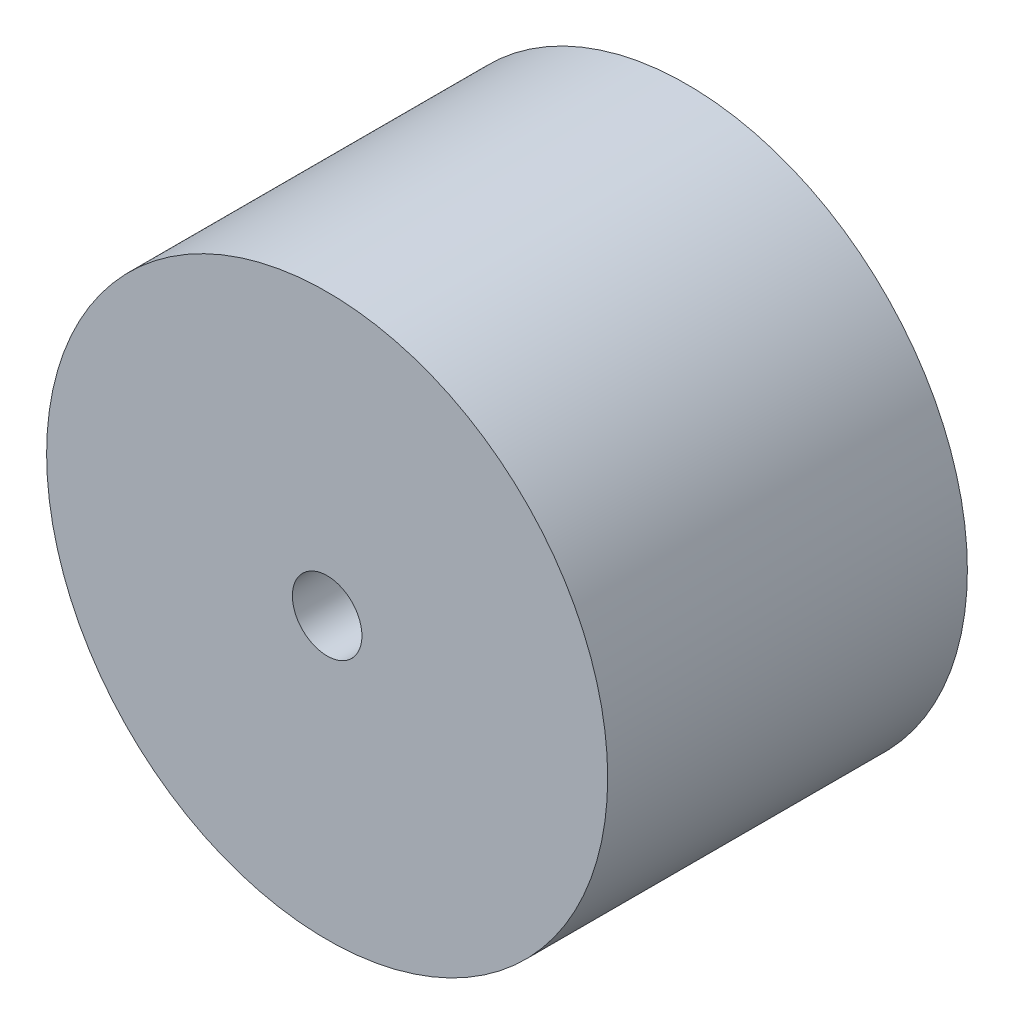
ISO-10303-21;
HEADER;
FILE_DESCRIPTION(('STEP AP214'),'2;1');
FILE_NAME('part.step','',(''),(''),'','','');
FILE_SCHEMA(('AUTOMOTIVE_DESIGN { 1 0 10303 214 1 1 1 1 }'));
ENDSEC;
DATA;
#1=APPLICATION_CONTEXT('core data for automotive mechanical design processes');
#2=APPLICATION_PROTOCOL_DEFINITION('international standard','automotive_design',2000,#1);
#3=PRODUCT_CONTEXT('',#1,'mechanical');
#4=PRODUCT('Part','Part','',(#3));
#5=PRODUCT_RELATED_PRODUCT_CATEGORY('part','',(#4));
#6=PRODUCT_DEFINITION_FORMATION('','',#4);
#7=PRODUCT_DEFINITION_CONTEXT('part definition',#1,'design');
#8=PRODUCT_DEFINITION('design','',#6,#7);
#9=PRODUCT_DEFINITION_SHAPE('','',#8);
#10=(LENGTH_UNIT() NAMED_UNIT(*) SI_UNIT(.MILLI.,.METRE.));
#11=(NAMED_UNIT(*) PLANE_ANGLE_UNIT() SI_UNIT($,.RADIAN.));
#12=(NAMED_UNIT(*) SI_UNIT($,.STERADIAN.) SOLID_ANGLE_UNIT());
#13=UNCERTAINTY_MEASURE_WITH_UNIT(LENGTH_MEASURE(1.E-05),#10,'distance_accuracy_value','');
#14=(GEOMETRIC_REPRESENTATION_CONTEXT(3) GLOBAL_UNCERTAINTY_ASSIGNED_CONTEXT((#13)) GLOBAL_UNIT_ASSIGNED_CONTEXT((#10,
#11,#12)) REPRESENTATION_CONTEXT('',''));
#15=CARTESIAN_POINT('',(0.,0.,0.));
#16=DIRECTION('',(0.,0.,1.));
#17=DIRECTION('',(1.,0.,0.));
#18=AXIS2_PLACEMENT_3D('',#15,#16,#17);
#19=CARTESIAN_POINT('',(0.,0.,525.272));
#20=DIRECTION('',(0.,0.,1.));
#21=DIRECTION('',(1.,0.,0.));
#22=AXIS2_PLACEMENT_3D('',#19,#20,#21);
#23=PLANE('',#22);
#24=CARTESIAN_POINT('',(0.,0.,525.272));
#25=DIRECTION('',(0.,0.,1.));
#26=DIRECTION('',(1.,0.,0.));
#27=AXIS2_PLACEMENT_3D('',#24,#25,#26);
#28=CIRCLE('',#27,409.702);
#29=CARTESIAN_POINT('',(409.702,0.,525.272));
#30=VERTEX_POINT('',#29);
#31=EDGE_CURVE('E10',#30,#30,#28,.T.);
#32=ORIENTED_EDGE('',*,*,#31,.T.);
#33=EDGE_LOOP('',(#32));
#34=FACE_BOUND('',#33,.T.);
#35=CARTESIAN_POINT('',(0.,0.,525.272));
#36=DIRECTION('',(0.,0.,1.));
#37=DIRECTION('',(1.,0.,0.));
#38=AXIS2_PLACEMENT_3D('',#35,#36,#37);
#39=CIRCLE('',#38,50.8);
#40=CARTESIAN_POINT('',(50.8,0.,525.272));
#41=VERTEX_POINT('',#40);
#42=EDGE_CURVE('E42',#41,#41,#39,.T.);
#43=ORIENTED_EDGE('',*,*,#42,.F.);
#44=EDGE_LOOP('',(#43));
#45=FACE_BOUND('',#44,.T.);
#46=ADVANCED_FACE('F31',(#34,#45),#23,.T.);
#47=CARTESIAN_POINT('',(0.,0.,0.));
#48=DIRECTION('',(0.,0.,1.));
#49=DIRECTION('',(1.,0.,0.));
#50=AXIS2_PLACEMENT_3D('',#47,#48,#49);
#51=PLANE('',#50);
#52=CARTESIAN_POINT('',(0.,0.,0.));
#53=DIRECTION('',(0.,0.,1.));
#54=DIRECTION('',(1.,0.,0.));
#55=AXIS2_PLACEMENT_3D('',#52,#53,#54);
#56=CIRCLE('',#55,409.702);
#57=CARTESIAN_POINT('',(409.702,0.,0.));
#58=VERTEX_POINT('',#57);
#59=EDGE_CURVE('E35',#58,#58,#56,.T.);
#60=ORIENTED_EDGE('',*,*,#59,.F.);
#61=EDGE_LOOP('',(#60));
#62=FACE_BOUND('',#61,.T.);
#63=CARTESIAN_POINT('',(0.,0.,0.));
#64=DIRECTION('',(0.,0.,1.));
#65=DIRECTION('',(1.,0.,0.));
#66=AXIS2_PLACEMENT_3D('',#63,#64,#65);
#67=CIRCLE('',#66,50.8);
#68=CARTESIAN_POINT('',(50.8,0.,0.));
#69=VERTEX_POINT('',#68);
#70=EDGE_CURVE('E44',#69,#69,#67,.T.);
#71=ORIENTED_EDGE('',*,*,#70,.T.);
#72=EDGE_LOOP('',(#71));
#73=FACE_BOUND('',#72,.T.);
#74=ADVANCED_FACE('F54',(#62,#73),#51,.F.);
#75=CARTESIAN_POINT('',(0.,0.,525.272));
#76=DIRECTION('',(0.,0.,-1.));
#77=DIRECTION('',(-1.,0.,0.));
#78=AXIS2_PLACEMENT_3D('',#75,#76,#77);
#79=CYLINDRICAL_SURFACE('',#78,409.702);
#80=ORIENTED_EDGE('',*,*,#31,.F.);
#81=EDGE_LOOP('',(#80));
#82=FACE_BOUND('',#81,.T.);
#83=ORIENTED_EDGE('',*,*,#59,.T.);
#84=EDGE_LOOP('',(#83));
#85=FACE_BOUND('',#84,.T.);
#86=ADVANCED_FACE('F33',(#82,#85),#79,.T.);
#87=CARTESIAN_POINT('',(0.,0.,525.272));
#88=DIRECTION('',(0.,0.,-1.));
#89=DIRECTION('',(-1.,0.,0.));
#90=AXIS2_PLACEMENT_3D('',#87,#88,#89);
#91=CYLINDRICAL_SURFACE('',#90,50.8);
#92=ORIENTED_EDGE('',*,*,#42,.T.);
#93=EDGE_LOOP('',(#92));
#94=FACE_BOUND('',#93,.T.);
#95=ORIENTED_EDGE('',*,*,#70,.F.);
#96=EDGE_LOOP('',(#95));
#97=FACE_BOUND('',#96,.T.);
#98=ADVANCED_FACE('F50',(#94,#97),#91,.F.);
#99=CLOSED_SHELL('',(#46,#74,#86,#98));
#100=MANIFOLD_SOLID_BREP('B2',#99);
#101=ADVANCED_BREP_SHAPE_REPRESENTATION('',(#18,#100),#14);
#102=SHAPE_DEFINITION_REPRESENTATION(#9,#101);
ENDSEC;
END-ISO-10303-21;
